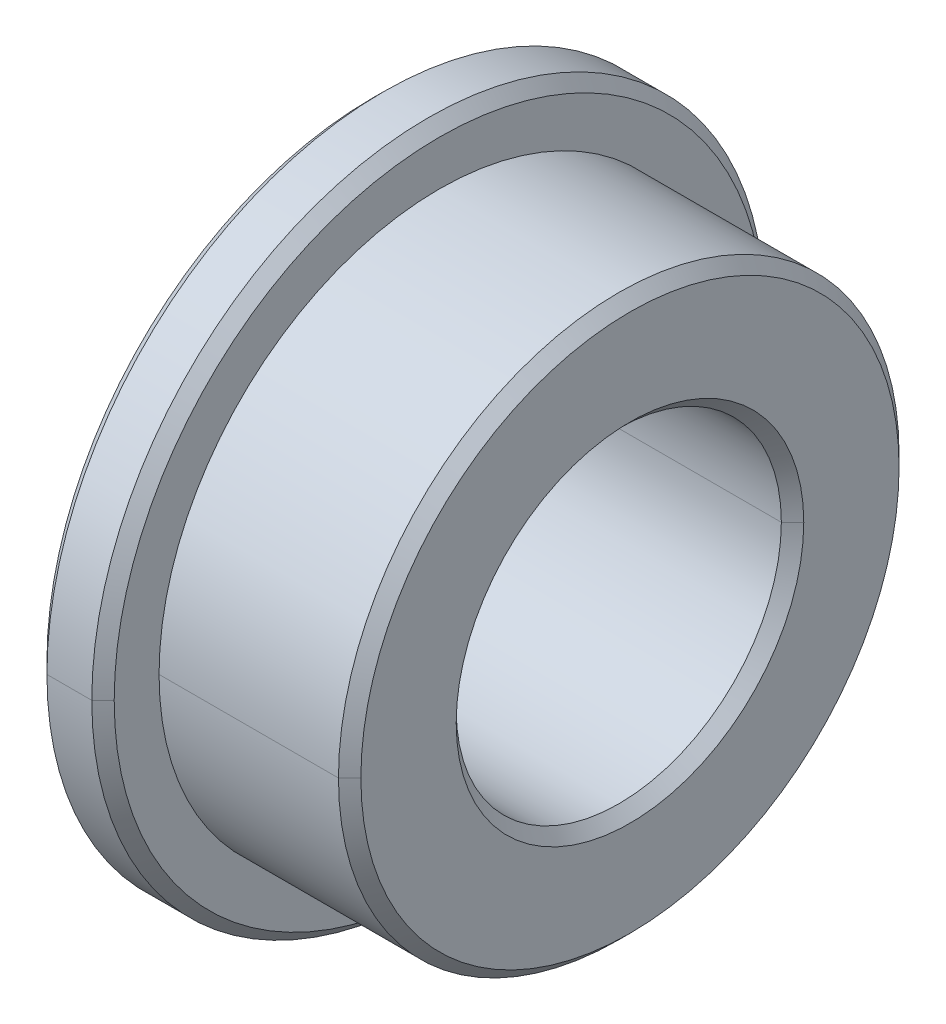
ISO-10303-21;
HEADER;
FILE_DESCRIPTION(('STEP AP214'),'2;1');
FILE_NAME('part.step','',(''),(''),'','','');
FILE_SCHEMA(('AUTOMOTIVE_DESIGN { 1 0 10303 214 1 1 1 1 }'));
ENDSEC;
DATA;
#1=APPLICATION_CONTEXT('core data for automotive mechanical design processes');
#2=APPLICATION_PROTOCOL_DEFINITION('international standard','automotive_design',2000,#1);
#3=PRODUCT_CONTEXT('',#1,'mechanical');
#4=PRODUCT('Part','Part','',(#3));
#5=PRODUCT_RELATED_PRODUCT_CATEGORY('part','',(#4));
#6=PRODUCT_DEFINITION_FORMATION('','',#4);
#7=PRODUCT_DEFINITION_CONTEXT('part definition',#1,'design');
#8=PRODUCT_DEFINITION('design','',#6,#7);
#9=PRODUCT_DEFINITION_SHAPE('','',#8);
#10=(LENGTH_UNIT() NAMED_UNIT(*) SI_UNIT(.MILLI.,.METRE.));
#11=(NAMED_UNIT(*) PLANE_ANGLE_UNIT() SI_UNIT($,.RADIAN.));
#12=(NAMED_UNIT(*) SI_UNIT($,.STERADIAN.) SOLID_ANGLE_UNIT());
#13=UNCERTAINTY_MEASURE_WITH_UNIT(LENGTH_MEASURE(1.E-05),#10,'distance_accuracy_value','');
#14=(GEOMETRIC_REPRESENTATION_CONTEXT(3) GLOBAL_UNCERTAINTY_ASSIGNED_CONTEXT((#13)) GLOBAL_UNIT_ASSIGNED_CONTEXT((#10,
#11,#12)) REPRESENTATION_CONTEXT('',''));
#15=CARTESIAN_POINT('',(0.,0.,0.));
#16=DIRECTION('',(0.,0.,1.));
#17=DIRECTION('',(1.,0.,0.));
#18=AXIS2_PLACEMENT_3D('',#15,#16,#17);
#19=CARTESIAN_POINT('',(0.,14.5,0.));
#20=DIRECTION('',(-1.,0.,0.));
#21=DIRECTION('',(0.,0.,1.));
#22=AXIS2_PLACEMENT_3D('',#19,#20,#21);
#23=PLANE('',#22);
#24=CARTESIAN_POINT('',(0.,0.,0.));
#25=DIRECTION('',(1.,0.,0.));
#26=DIRECTION('',(0.,0.,-1.));
#27=AXIS2_PLACEMENT_3D('',#24,#25,#26);
#28=CIRCLE('',#27,7.75);
#29=CARTESIAN_POINT('',(0.,0.,-7.75));
#30=VERTEX_POINT('',#29);
#31=CARTESIAN_POINT('',(0.,0.,7.75));
#32=VERTEX_POINT('',#31);
#33=EDGE_CURVE('E11',#30,#32,#28,.T.);
#34=ORIENTED_EDGE('',*,*,#33,.T.);
#35=CARTESIAN_POINT('',(0.,0.,0.));
#36=DIRECTION('',(1.,0.,0.));
#37=DIRECTION('',(0.,0.,-1.));
#38=AXIS2_PLACEMENT_3D('',#35,#36,#37);
#39=CIRCLE('',#38,7.75);
#40=EDGE_CURVE('E25',#32,#30,#39,.T.);
#41=ORIENTED_EDGE('',*,*,#40,.T.);
#42=EDGE_LOOP('',(#34,#41));
#43=FACE_BOUND('',#42,.T.);
#44=CARTESIAN_POINT('',(0.,0.,0.));
#45=DIRECTION('',(1.,0.,0.));
#46=DIRECTION('',(0.,0.,-1.));
#47=AXIS2_PLACEMENT_3D('',#44,#45,#46);
#48=CIRCLE('',#47,14.5);
#49=CARTESIAN_POINT('',(0.,0.,14.5));
#50=VERTEX_POINT('',#49);
#51=CARTESIAN_POINT('',(0.,0.,-14.5));
#52=VERTEX_POINT('',#51);
#53=EDGE_CURVE('E274',#50,#52,#48,.T.);
#54=ORIENTED_EDGE('',*,*,#53,.F.);
#55=CARTESIAN_POINT('',(0.,0.,0.));
#56=DIRECTION('',(1.,0.,0.));
#57=DIRECTION('',(0.,0.,-1.));
#58=AXIS2_PLACEMENT_3D('',#55,#56,#57);
#59=CIRCLE('',#58,14.5);
#60=EDGE_CURVE('E269',#52,#50,#59,.T.);
#61=ORIENTED_EDGE('',*,*,#60,.F.);
#62=EDGE_LOOP('',(#54,#61));
#63=FACE_BOUND('',#62,.T.);
#64=ADVANCED_FACE('F17',(#43,#63),#23,.T.);
#65=CARTESIAN_POINT('',(0.5,0.,0.));
#66=DIRECTION('',(1.,0.,0.));
#67=DIRECTION('',(0.,-1.,0.));
#68=AXIS2_PLACEMENT_3D('',#65,#66,#67);
#69=CONICAL_SURFACE('',#68,15.,0.785398163397446);
#70=DIRECTION('',(0.707106781186549,0.,0.707106781186546));
#71=VECTOR('',#70,1.);
#72=CARTESIAN_POINT('',(0.,0.,14.5));
#73=LINE('',#72,#71);
#74=CARTESIAN_POINT('',(0.5,0.,15.));
#75=VERTEX_POINT('',#74);
#76=EDGE_CURVE('E265',#50,#75,#73,.T.);
#77=ORIENTED_EDGE('',*,*,#76,.T.);
#78=CARTESIAN_POINT('',(0.5,0.,0.));
#79=DIRECTION('',(1.,0.,0.));
#80=DIRECTION('',(0.,0.,-1.));
#81=AXIS2_PLACEMENT_3D('',#78,#79,#80);
#82=CIRCLE('',#81,15.);
#83=CARTESIAN_POINT('',(0.5,0.,-15.));
#84=VERTEX_POINT('',#83);
#85=EDGE_CURVE('E260',#84,#75,#82,.T.);
#86=ORIENTED_EDGE('',*,*,#85,.F.);
#87=DIRECTION('',(0.707106781186549,0.,-0.707106781186546));
#88=VECTOR('',#87,1.);
#89=CARTESIAN_POINT('',(0.,0.,-14.5));
#90=LINE('',#89,#88);
#91=EDGE_CURVE('E255',#52,#84,#90,.T.);
#92=ORIENTED_EDGE('',*,*,#91,.F.);
#93=ORIENTED_EDGE('',*,*,#60,.T.);
#94=EDGE_LOOP('',(#77,#86,#92,#93));
#95=FACE_BOUND('',#94,.T.);
#96=ADVANCED_FACE('F290',(#95),#69,.T.);
#97=CARTESIAN_POINT('',(0.5,0.,0.));
#98=DIRECTION('',(1.,0.,0.));
#99=DIRECTION('',(0.,1.,0.));
#100=AXIS2_PLACEMENT_3D('',#97,#98,#99);
#101=CONICAL_SURFACE('',#100,15.,0.785398163397446);
#102=ORIENTED_EDGE('',*,*,#76,.F.);
#103=ORIENTED_EDGE('',*,*,#53,.T.);
#104=ORIENTED_EDGE('',*,*,#91,.T.);
#105=CARTESIAN_POINT('',(0.5,0.,0.));
#106=DIRECTION('',(1.,0.,0.));
#107=DIRECTION('',(0.,0.,-1.));
#108=AXIS2_PLACEMENT_3D('',#105,#106,#107);
#109=CIRCLE('',#108,15.);
#110=EDGE_CURVE('E250',#75,#84,#109,.T.);
#111=ORIENTED_EDGE('',*,*,#110,.F.);
#112=EDGE_LOOP('',(#102,#103,#104,#111));
#113=FACE_BOUND('',#112,.T.);
#114=ADVANCED_FACE('F285',(#113),#101,.T.);
#115=CARTESIAN_POINT('',(10.,0.,0.));
#116=DIRECTION('',(1.,0.,0.));
#117=DIRECTION('',(0.,1.,0.));
#118=AXIS2_PLACEMENT_3D('',#115,#116,#117);
#119=CYLINDRICAL_SURFACE('',#118,15.);
#120=DIRECTION('',(1.,0.,0.));
#121=VECTOR('',#120,1.);
#122=CARTESIAN_POINT('',(0.5,0.,15.));
#123=LINE('',#122,#121);
#124=CARTESIAN_POINT('',(2.5,0.,15.));
#125=VERTEX_POINT('',#124);
#126=EDGE_CURVE('E245',#75,#125,#123,.T.);
#127=ORIENTED_EDGE('',*,*,#126,.F.);
#128=ORIENTED_EDGE('',*,*,#110,.T.);
#129=DIRECTION('',(1.,0.,0.));
#130=VECTOR('',#129,1.);
#131=CARTESIAN_POINT('',(0.5,0.,-15.));
#132=LINE('',#131,#130);
#133=CARTESIAN_POINT('',(2.5,0.,-15.));
#134=VERTEX_POINT('',#133);
#135=EDGE_CURVE('E241',#84,#134,#132,.T.);
#136=ORIENTED_EDGE('',*,*,#135,.T.);
#137=CARTESIAN_POINT('',(2.5,0.,0.));
#138=DIRECTION('',(1.,0.,0.));
#139=DIRECTION('',(0.,0.,-1.));
#140=AXIS2_PLACEMENT_3D('',#137,#138,#139);
#141=CIRCLE('',#140,15.);
#142=EDGE_CURVE('E236',#125,#134,#141,.T.);
#143=ORIENTED_EDGE('',*,*,#142,.F.);
#144=EDGE_LOOP('',(#127,#128,#136,#143));
#145=FACE_BOUND('',#144,.T.);
#146=ADVANCED_FACE('F297',(#145),#119,.T.);
#147=CARTESIAN_POINT('',(3.,0.,0.));
#148=DIRECTION('',(-1.,0.,0.));
#149=DIRECTION('',(0.,1.,0.));
#150=AXIS2_PLACEMENT_3D('',#147,#148,#149);
#151=CONICAL_SURFACE('',#150,14.5,0.785398163397448);
#152=DIRECTION('',(-0.707106781186548,0.,-0.707106781186548));
#153=VECTOR('',#152,1.);
#154=CARTESIAN_POINT('',(3.,0.,-14.5));
#155=LINE('',#154,#153);
#156=CARTESIAN_POINT('',(3.,0.,-14.5));
#157=VERTEX_POINT('',#156);
#158=EDGE_CURVE('E231',#157,#134,#155,.T.);
#159=ORIENTED_EDGE('',*,*,#158,.F.);
#160=CARTESIAN_POINT('',(3.,0.,0.));
#161=DIRECTION('',(1.,0.,0.));
#162=DIRECTION('',(0.,0.,-1.));
#163=AXIS2_PLACEMENT_3D('',#160,#161,#162);
#164=CIRCLE('',#163,14.5);
#165=CARTESIAN_POINT('',(3.,0.,14.5));
#166=VERTEX_POINT('',#165);
#167=EDGE_CURVE('E226',#166,#157,#164,.T.);
#168=ORIENTED_EDGE('',*,*,#167,.F.);
#169=DIRECTION('',(-0.707106781186548,0.,0.707106781186548));
#170=VECTOR('',#169,1.);
#171=CARTESIAN_POINT('',(3.,0.,14.5));
#172=LINE('',#171,#170);
#173=EDGE_CURVE('E221',#166,#125,#172,.T.);
#174=ORIENTED_EDGE('',*,*,#173,.T.);
#175=ORIENTED_EDGE('',*,*,#142,.T.);
#176=EDGE_LOOP('',(#159,#168,#174,#175));
#177=FACE_BOUND('',#176,.T.);
#178=ADVANCED_FACE('F299',(#177),#151,.T.);
#179=CARTESIAN_POINT('',(3.,0.,0.));
#180=DIRECTION('',(-1.,0.,0.));
#181=DIRECTION('',(0.,-1.,0.));
#182=AXIS2_PLACEMENT_3D('',#179,#180,#181);
#183=CONICAL_SURFACE('',#182,14.5,0.785398163397448);
#184=ORIENTED_EDGE('',*,*,#158,.T.);
#185=CARTESIAN_POINT('',(2.5,0.,0.));
#186=DIRECTION('',(1.,0.,0.));
#187=DIRECTION('',(0.,0.,-1.));
#188=AXIS2_PLACEMENT_3D('',#185,#186,#187);
#189=CIRCLE('',#188,15.);
#190=EDGE_CURVE('E216',#134,#125,#189,.T.);
#191=ORIENTED_EDGE('',*,*,#190,.T.);
#192=ORIENTED_EDGE('',*,*,#173,.F.);
#193=CARTESIAN_POINT('',(3.,0.,0.));
#194=DIRECTION('',(1.,0.,0.));
#195=DIRECTION('',(0.,0.,-1.));
#196=AXIS2_PLACEMENT_3D('',#193,#194,#195);
#197=CIRCLE('',#196,14.5);
#198=EDGE_CURVE('E211',#157,#166,#197,.T.);
#199=ORIENTED_EDGE('',*,*,#198,.F.);
#200=EDGE_LOOP('',(#184,#191,#192,#199));
#201=FACE_BOUND('',#200,.T.);
#202=ADVANCED_FACE('F303',(#201),#183,.T.);
#203=CARTESIAN_POINT('',(3.,12.5,0.));
#204=DIRECTION('',(1.,0.,0.));
#205=DIRECTION('',(0.,0.,-1.));
#206=AXIS2_PLACEMENT_3D('',#203,#204,#205);
#207=PLANE('',#206);
#208=ORIENTED_EDGE('',*,*,#198,.T.);
#209=ORIENTED_EDGE('',*,*,#167,.T.);
#210=EDGE_LOOP('',(#208,#209));
#211=FACE_BOUND('',#210,.T.);
#212=CARTESIAN_POINT('',(3.,0.,0.));
#213=DIRECTION('',(1.,0.,0.));
#214=DIRECTION('',(0.,0.,-1.));
#215=AXIS2_PLACEMENT_3D('',#212,#213,#214);
#216=CIRCLE('',#215,12.5);
#217=CARTESIAN_POINT('',(3.,0.,12.5));
#218=VERTEX_POINT('',#217);
#219=CARTESIAN_POINT('',(3.,0.,-12.5));
#220=VERTEX_POINT('',#219);
#221=EDGE_CURVE('E206',#218,#220,#216,.T.);
#222=ORIENTED_EDGE('',*,*,#221,.F.);
#223=CARTESIAN_POINT('',(3.,0.,0.));
#224=DIRECTION('',(1.,0.,0.));
#225=DIRECTION('',(0.,0.,-1.));
#226=AXIS2_PLACEMENT_3D('',#223,#224,#225);
#227=CIRCLE('',#226,12.5);
#228=EDGE_CURVE('E201',#220,#218,#227,.T.);
#229=ORIENTED_EDGE('',*,*,#228,.F.);
#230=EDGE_LOOP('',(#222,#229));
#231=FACE_BOUND('',#230,.T.);
#232=ADVANCED_FACE('F305',(#211,#231),#207,.T.);
#233=CARTESIAN_POINT('',(10.,0.,0.));
#234=DIRECTION('',(1.,0.,0.));
#235=DIRECTION('',(0.,-1.,-2.35728675822409E-12));
#236=AXIS2_PLACEMENT_3D('',#233,#234,#235);
#237=CYLINDRICAL_SURFACE('',#236,12.5);
#238=DIRECTION('',(1.,0.,0.));
#239=VECTOR('',#238,1.);
#240=CARTESIAN_POINT('',(3.,0.,12.5));
#241=LINE('',#240,#239);
#242=CARTESIAN_POINT('',(11.,0.,12.5));
#243=VERTEX_POINT('',#242);
#244=EDGE_CURVE('E197',#218,#243,#241,.T.);
#245=ORIENTED_EDGE('',*,*,#244,.T.);
#246=CARTESIAN_POINT('',(11.,0.,0.));
#247=DIRECTION('',(1.,0.,0.));
#248=DIRECTION('',(0.,0.,-1.));
#249=AXIS2_PLACEMENT_3D('',#246,#247,#248);
#250=CIRCLE('',#249,12.5);
#251=CARTESIAN_POINT('',(11.,0.,-12.5));
#252=VERTEX_POINT('',#251);
#253=EDGE_CURVE('E192',#252,#243,#250,.T.);
#254=ORIENTED_EDGE('',*,*,#253,.F.);
#255=DIRECTION('',(1.,0.,0.));
#256=VECTOR('',#255,1.);
#257=CARTESIAN_POINT('',(3.,0.,-12.5));
#258=LINE('',#257,#256);
#259=EDGE_CURVE('E187',#220,#252,#258,.T.);
#260=ORIENTED_EDGE('',*,*,#259,.F.);
#261=ORIENTED_EDGE('',*,*,#228,.T.);
#262=EDGE_LOOP('',(#245,#254,#260,#261));
#263=FACE_BOUND('',#262,.T.);
#264=ADVANCED_FACE('F308',(#263),#237,.T.);
#265=CARTESIAN_POINT('',(10.,0.,0.));
#266=DIRECTION('',(1.,0.,0.));
#267=DIRECTION('',(0.,1.,0.));
#268=AXIS2_PLACEMENT_3D('',#265,#266,#267);
#269=CYLINDRICAL_SURFACE('',#268,12.5);
#270=ORIENTED_EDGE('',*,*,#244,.F.);
#271=ORIENTED_EDGE('',*,*,#221,.T.);
#272=ORIENTED_EDGE('',*,*,#259,.T.);
#273=CARTESIAN_POINT('',(11.,0.,0.));
#274=DIRECTION('',(1.,0.,0.));
#275=DIRECTION('',(0.,0.,-1.));
#276=AXIS2_PLACEMENT_3D('',#273,#274,#275);
#277=CIRCLE('',#276,12.5);
#278=EDGE_CURVE('E182',#243,#252,#277,.T.);
#279=ORIENTED_EDGE('',*,*,#278,.F.);
#280=EDGE_LOOP('',(#270,#271,#272,#279));
#281=FACE_BOUND('',#280,.T.);
#282=ADVANCED_FACE('F314',(#281),#269,.T.);
#283=CARTESIAN_POINT('',(11.5,0.,0.));
#284=DIRECTION('',(-1.,0.,0.));
#285=DIRECTION('',(0.,1.,0.));
#286=AXIS2_PLACEMENT_3D('',#283,#284,#285);
#287=CONICAL_SURFACE('',#286,12.,0.785398163397448);
#288=DIRECTION('',(-0.707106781186548,0.,-0.707106781186548));
#289=VECTOR('',#288,1.);
#290=CARTESIAN_POINT('',(11.5,0.,-12.));
#291=LINE('',#290,#289);
#292=CARTESIAN_POINT('',(11.5,0.,-12.));
#293=VERTEX_POINT('',#292);
#294=EDGE_CURVE('E177',#293,#252,#291,.T.);
#295=ORIENTED_EDGE('',*,*,#294,.F.);
#296=CARTESIAN_POINT('',(11.5,0.,0.));
#297=DIRECTION('',(1.,0.,0.));
#298=DIRECTION('',(0.,0.,-1.));
#299=AXIS2_PLACEMENT_3D('',#296,#297,#298);
#300=CIRCLE('',#299,12.);
#301=CARTESIAN_POINT('',(11.5,0.,12.));
#302=VERTEX_POINT('',#301);
#303=EDGE_CURVE('E172',#302,#293,#300,.T.);
#304=ORIENTED_EDGE('',*,*,#303,.F.);
#305=DIRECTION('',(-0.707106781186548,0.,0.707106781186548));
#306=VECTOR('',#305,1.);
#307=CARTESIAN_POINT('',(11.5,0.,12.));
#308=LINE('',#307,#306);
#309=EDGE_CURVE('E167',#302,#243,#308,.T.);
#310=ORIENTED_EDGE('',*,*,#309,.T.);
#311=ORIENTED_EDGE('',*,*,#278,.T.);
#312=EDGE_LOOP('',(#295,#304,#310,#311));
#313=FACE_BOUND('',#312,.T.);
#314=ADVANCED_FACE('F317',(#313),#287,.T.);
#315=CARTESIAN_POINT('',(11.5,0.,0.));
#316=DIRECTION('',(-1.,0.,0.));
#317=DIRECTION('',(0.,-1.,0.));
#318=AXIS2_PLACEMENT_3D('',#315,#316,#317);
#319=CONICAL_SURFACE('',#318,12.,0.785398163397448);
#320=ORIENTED_EDGE('',*,*,#294,.T.);
#321=ORIENTED_EDGE('',*,*,#253,.T.);
#322=ORIENTED_EDGE('',*,*,#309,.F.);
#323=CARTESIAN_POINT('',(11.5,0.,0.));
#324=DIRECTION('',(1.,0.,0.));
#325=DIRECTION('',(0.,0.,-1.));
#326=AXIS2_PLACEMENT_3D('',#323,#324,#325);
#327=CIRCLE('',#326,12.);
#328=EDGE_CURVE('E162',#293,#302,#327,.T.);
#329=ORIENTED_EDGE('',*,*,#328,.F.);
#330=EDGE_LOOP('',(#320,#321,#322,#329));
#331=FACE_BOUND('',#330,.T.);
#332=ADVANCED_FACE('F321',(#331),#319,.T.);
#333=CARTESIAN_POINT('',(11.5,7.75,0.));
#334=DIRECTION('',(1.,0.,0.));
#335=DIRECTION('',(0.,0.,-1.));
#336=AXIS2_PLACEMENT_3D('',#333,#334,#335);
#337=PLANE('',#336);
#338=ORIENTED_EDGE('',*,*,#328,.T.);
#339=ORIENTED_EDGE('',*,*,#303,.T.);
#340=EDGE_LOOP('',(#338,#339));
#341=FACE_BOUND('',#340,.T.);
#342=CARTESIAN_POINT('',(11.5,0.,0.));
#343=DIRECTION('',(1.,0.,0.));
#344=DIRECTION('',(0.,0.,-1.));
#345=AXIS2_PLACEMENT_3D('',#342,#343,#344);
#346=CIRCLE('',#345,7.75);
#347=CARTESIAN_POINT('',(11.5,0.,7.75));
#348=VERTEX_POINT('',#347);
#349=CARTESIAN_POINT('',(11.5,0.,-7.75));
#350=VERTEX_POINT('',#349);
#351=EDGE_CURVE('E157',#348,#350,#346,.T.);
#352=ORIENTED_EDGE('',*,*,#351,.F.);
#353=CARTESIAN_POINT('',(11.5,0.,0.));
#354=DIRECTION('',(1.,0.,0.));
#355=DIRECTION('',(0.,0.,-1.));
#356=AXIS2_PLACEMENT_3D('',#353,#354,#355);
#357=CIRCLE('',#356,7.75);
#358=EDGE_CURVE('E152',#350,#348,#357,.T.);
#359=ORIENTED_EDGE('',*,*,#358,.F.);
#360=EDGE_LOOP('',(#352,#359));
#361=FACE_BOUND('',#360,.T.);
#362=ADVANCED_FACE('F323',(#341,#361),#337,.T.);
#363=CARTESIAN_POINT('',(11.,0.,0.));
#364=DIRECTION('',(1.,0.,0.));
#365=DIRECTION('',(0.,-1.,0.));
#366=AXIS2_PLACEMENT_3D('',#363,#364,#365);
#367=CONICAL_SURFACE('',#366,7.25,0.785398163397448);
#368=DIRECTION('',(0.707106781186548,0.,0.707106781186548));
#369=VECTOR('',#368,1.);
#370=CARTESIAN_POINT('',(11.,0.,7.25));
#371=LINE('',#370,#369);
#372=CARTESIAN_POINT('',(11.,0.,7.25));
#373=VERTEX_POINT('',#372);
#374=EDGE_CURVE('E147',#373,#348,#371,.T.);
#375=ORIENTED_EDGE('',*,*,#374,.F.);
#376=CARTESIAN_POINT('',(11.,0.,0.));
#377=DIRECTION('',(1.,0.,0.));
#378=DIRECTION('',(0.,0.,-1.));
#379=AXIS2_PLACEMENT_3D('',#376,#377,#378);
#380=CIRCLE('',#379,7.25);
#381=CARTESIAN_POINT('',(11.,0.,-7.25));
#382=VERTEX_POINT('',#381);
#383=EDGE_CURVE('E114',#382,#373,#380,.T.);
#384=ORIENTED_EDGE('',*,*,#383,.F.);
#385=DIRECTION('',(0.707106781186548,0.,-0.707106781186548));
#386=VECTOR('',#385,1.);
#387=CARTESIAN_POINT('',(11.,0.,-7.25));
#388=LINE('',#387,#386);
#389=EDGE_CURVE('E139',#382,#350,#388,.T.);
#390=ORIENTED_EDGE('',*,*,#389,.T.);
#391=ORIENTED_EDGE('',*,*,#358,.T.);
#392=EDGE_LOOP('',(#375,#384,#390,#391));
#393=FACE_BOUND('',#392,.T.);
#394=ADVANCED_FACE('F326',(#393),#367,.F.);
#395=CARTESIAN_POINT('',(11.,0.,0.));
#396=DIRECTION('',(1.,0.,0.));
#397=DIRECTION('',(0.,1.,0.));
#398=AXIS2_PLACEMENT_3D('',#395,#396,#397);
#399=CONICAL_SURFACE('',#398,7.25,0.785398163397448);
#400=ORIENTED_EDGE('',*,*,#374,.T.);
#401=ORIENTED_EDGE('',*,*,#351,.T.);
#402=ORIENTED_EDGE('',*,*,#389,.F.);
#403=CARTESIAN_POINT('',(11.,0.,0.));
#404=DIRECTION('',(1.,0.,0.));
#405=DIRECTION('',(0.,0.,-1.));
#406=AXIS2_PLACEMENT_3D('',#403,#404,#405);
#407=CIRCLE('',#406,7.25);
#408=EDGE_CURVE('E115',#373,#382,#407,.T.);
#409=ORIENTED_EDGE('',*,*,#408,.F.);
#410=EDGE_LOOP('',(#400,#401,#402,#409));
#411=FACE_BOUND('',#410,.T.);
#412=ADVANCED_FACE('F331',(#411),#399,.F.);
#413=CARTESIAN_POINT('',(10.,0.,0.));
#414=DIRECTION('',(1.,0.,0.));
#415=DIRECTION('',(0.,1.,0.));
#416=AXIS2_PLACEMENT_3D('',#413,#414,#415);
#417=CYLINDRICAL_SURFACE('',#416,7.25);
#418=DIRECTION('',(1.,0.,0.));
#419=VECTOR('',#418,1.);
#420=CARTESIAN_POINT('',(0.5,0.,7.25));
#421=LINE('',#420,#419);
#422=CARTESIAN_POINT('',(0.500000000000001,0.,7.25));
#423=VERTEX_POINT('',#422);
#424=EDGE_CURVE('E100',#423,#373,#421,.T.);
#425=ORIENTED_EDGE('',*,*,#424,.T.);
#426=ORIENTED_EDGE('',*,*,#408,.T.);
#427=DIRECTION('',(1.,0.,0.));
#428=VECTOR('',#427,1.);
#429=CARTESIAN_POINT('',(0.5,0.,-7.25));
#430=LINE('',#429,#428);
#431=CARTESIAN_POINT('',(0.5,0.,-7.25));
#432=VERTEX_POINT('',#431);
#433=EDGE_CURVE('E103',#432,#382,#430,.T.);
#434=ORIENTED_EDGE('',*,*,#433,.F.);
#435=CARTESIAN_POINT('',(0.5,0.,0.));
#436=DIRECTION('',(1.,0.,0.));
#437=DIRECTION('',(0.,0.,-1.));
#438=AXIS2_PLACEMENT_3D('',#435,#436,#437);
#439=CIRCLE('',#438,7.25);
#440=EDGE_CURVE('E96',#423,#432,#439,.T.);
#441=ORIENTED_EDGE('',*,*,#440,.F.);
#442=EDGE_LOOP('',(#425,#426,#434,#441));
#443=FACE_BOUND('',#442,.T.);
#444=ADVANCED_FACE('F98',(#443),#417,.F.);
#445=CARTESIAN_POINT('',(0.,0.,0.));
#446=DIRECTION('',(-1.,0.,0.));
#447=DIRECTION('',(0.,1.,0.));
#448=AXIS2_PLACEMENT_3D('',#445,#446,#447);
#449=CONICAL_SURFACE('',#448,7.75,0.785398163397448);
#450=DIRECTION('',(-0.707106781186548,0.,-0.707106781186547));
#451=VECTOR('',#450,1.);
#452=CARTESIAN_POINT('',(0.500000000000001,0.,-7.25));
#453=LINE('',#452,#451);
#454=EDGE_CURVE('E107',#432,#30,#453,.T.);
#455=ORIENTED_EDGE('',*,*,#454,.T.);
#456=ORIENTED_EDGE('',*,*,#40,.F.);
#457=DIRECTION('',(-0.707106781186548,0.,0.707106781186547));
#458=VECTOR('',#457,1.);
#459=CARTESIAN_POINT('',(0.500000000000001,0.,7.25));
#460=LINE('',#459,#458);
#461=EDGE_CURVE('E119',#423,#32,#460,.T.);
#462=ORIENTED_EDGE('',*,*,#461,.F.);
#463=ORIENTED_EDGE('',*,*,#440,.T.);
#464=EDGE_LOOP('',(#455,#456,#462,#463));
#465=FACE_BOUND('',#464,.T.);
#466=ADVANCED_FACE('F121',(#465),#449,.F.);
#467=CARTESIAN_POINT('',(0.,0.,0.));
#468=DIRECTION('',(-1.,0.,0.));
#469=DIRECTION('',(0.,-1.,0.));
#470=AXIS2_PLACEMENT_3D('',#467,#468,#469);
#471=CONICAL_SURFACE('',#470,7.75,0.785398163397448);
#472=ORIENTED_EDGE('',*,*,#454,.F.);
#473=CARTESIAN_POINT('',(0.5,0.,0.));
#474=DIRECTION('',(1.,0.,0.));
#475=DIRECTION('',(0.,0.,-1.));
#476=AXIS2_PLACEMENT_3D('',#473,#474,#475);
#477=CIRCLE('',#476,7.25);
#478=EDGE_CURVE('E112',#432,#423,#477,.T.);
#479=ORIENTED_EDGE('',*,*,#478,.T.);
#480=ORIENTED_EDGE('',*,*,#461,.T.);
#481=ORIENTED_EDGE('',*,*,#33,.F.);
#482=EDGE_LOOP('',(#472,#479,#480,#481));
#483=FACE_BOUND('',#482,.T.);
#484=ADVANCED_FACE('F118',(#483),#471,.F.);
#485=CARTESIAN_POINT('',(10.,0.,0.));
#486=DIRECTION('',(1.,0.,0.));
#487=DIRECTION('',(0.,-1.,0.));
#488=AXIS2_PLACEMENT_3D('',#485,#486,#487);
#489=CYLINDRICAL_SURFACE('',#488,7.25);
#490=ORIENTED_EDGE('',*,*,#424,.F.);
#491=ORIENTED_EDGE('',*,*,#478,.F.);
#492=ORIENTED_EDGE('',*,*,#433,.T.);
#493=ORIENTED_EDGE('',*,*,#383,.T.);
#494=EDGE_LOOP('',(#490,#491,#492,#493));
#495=FACE_BOUND('',#494,.T.);
#496=ADVANCED_FACE('F111',(#495),#489,.F.);
#497=CARTESIAN_POINT('',(10.,0.,0.));
#498=DIRECTION('',(1.,0.,0.));
#499=DIRECTION('',(0.,-1.,0.));
#500=AXIS2_PLACEMENT_3D('',#497,#498,#499);
#501=CYLINDRICAL_SURFACE('',#500,15.);
#502=ORIENTED_EDGE('',*,*,#126,.T.);
#503=ORIENTED_EDGE('',*,*,#190,.F.);
#504=ORIENTED_EDGE('',*,*,#135,.F.);
#505=ORIENTED_EDGE('',*,*,#85,.T.);
#506=EDGE_LOOP('',(#502,#503,#504,#505));
#507=FACE_BOUND('',#506,.T.);
#508=ADVANCED_FACE('F293',(#507),#501,.T.);
#509=CLOSED_SHELL('',(#64,#96,#114,#146,#178,#202,#232,#264,#282,#314,#332,#362,#394,#412,#444,
#466,#484,#496,#508));
#510=MANIFOLD_SOLID_BREP('B1',#509);
#511=ADVANCED_BREP_SHAPE_REPRESENTATION('',(#18,#510),#14);
#512=SHAPE_DEFINITION_REPRESENTATION(#9,#511);
ENDSEC;
END-ISO-10303-21;
